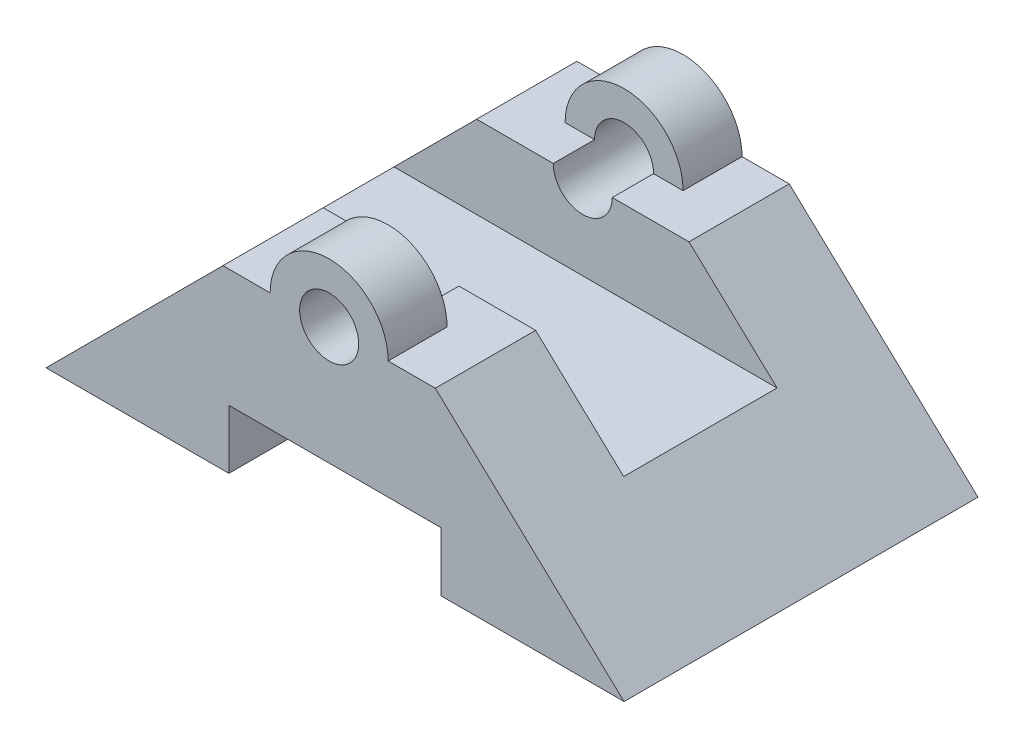
ISO-10303-21;
HEADER;
FILE_DESCRIPTION(('STEP AP214'),'2;1');
FILE_NAME('part.step','',(''),(''),'','','');
FILE_SCHEMA(('AUTOMOTIVE_DESIGN { 1 0 10303 214 1 1 1 1 }'));
ENDSEC;
DATA;
#1=APPLICATION_CONTEXT('core data for automotive mechanical design processes');
#2=APPLICATION_PROTOCOL_DEFINITION('international standard','automotive_design',2000,#1);
#3=PRODUCT_CONTEXT('',#1,'mechanical');
#4=PRODUCT('Part','Part','',(#3));
#5=PRODUCT_RELATED_PRODUCT_CATEGORY('part','',(#4));
#6=PRODUCT_DEFINITION_FORMATION('','',#4);
#7=PRODUCT_DEFINITION_CONTEXT('part definition',#1,'design');
#8=PRODUCT_DEFINITION('design','',#6,#7);
#9=PRODUCT_DEFINITION_SHAPE('','',#8);
#10=(LENGTH_UNIT() NAMED_UNIT(*) SI_UNIT(.MILLI.,.METRE.));
#11=(NAMED_UNIT(*) PLANE_ANGLE_UNIT() SI_UNIT($,.RADIAN.));
#12=(NAMED_UNIT(*) SI_UNIT($,.STERADIAN.) SOLID_ANGLE_UNIT());
#13=UNCERTAINTY_MEASURE_WITH_UNIT(LENGTH_MEASURE(1.E-05),#10,'distance_accuracy_value','');
#14=(GEOMETRIC_REPRESENTATION_CONTEXT(3) GLOBAL_UNCERTAINTY_ASSIGNED_CONTEXT((#13)) GLOBAL_UNIT_ASSIGNED_CONTEXT((#10,
#11,#12)) REPRESENTATION_CONTEXT('',''));
#15=CARTESIAN_POINT('',(0.,0.,0.));
#16=DIRECTION('',(0.,0.,1.));
#17=DIRECTION('',(1.,0.,0.));
#18=AXIS2_PLACEMENT_3D('',#15,#16,#17);
#19=CARTESIAN_POINT('',(-5.21948843325752,15.1358930192069,-17.));
#20=DIRECTION('',(0.,1.,0.));
#21=DIRECTION('',(0.,0.,1.));
#22=AXIS2_PLACEMENT_3D('',#19,#20,#21);
#23=PLANE('',#22);
#24=DIRECTION('',(0.,0.,1.));
#25=VECTOR('',#24,1.);
#26=CARTESIAN_POINT('',(7.78051156674249,15.1358930192069,-17.));
#27=LINE('',#26,#25);
#28=CARTESIAN_POINT('',(7.78051156674249,15.1358930192069,-17.));
#29=VERTEX_POINT('',#28);
#30=CARTESIAN_POINT('',(7.78051156674249,15.1358930192069,-10.));
#31=VERTEX_POINT('',#30);
#32=EDGE_CURVE('E62',#29,#31,#27,.T.);
#33=ORIENTED_EDGE('',*,*,#32,.F.);
#34=DIRECTION('',(-1.,0.,0.));
#35=VECTOR('',#34,1.);
#36=CARTESIAN_POINT('',(30.7805115667425,15.1358930192069,-17.));
#37=LINE('',#36,#35);
#38=CARTESIAN_POINT('',(-5.21948843325752,15.1358930192069,-17.));
#39=VERTEX_POINT('',#38);
#40=EDGE_CURVE('E269',#29,#39,#37,.T.);
#41=ORIENTED_EDGE('',*,*,#40,.T.);
#42=DIRECTION('',(0.,0.,1.));
#43=VECTOR('',#42,1.);
#44=CARTESIAN_POINT('',(-5.21948843325752,15.1358930192069,-17.));
#45=LINE('',#44,#43);
#46=CARTESIAN_POINT('',(-5.21948843325752,15.1358930192069,0.));
#47=VERTEX_POINT('',#46);
#48=EDGE_CURVE('E303',#39,#47,#45,.T.);
#49=ORIENTED_EDGE('',*,*,#48,.T.);
#50=DIRECTION('',(-1.,0.,0.));
#51=VECTOR('',#50,1.);
#52=CARTESIAN_POINT('',(-5.21948843325752,15.1358930192069,0.));
#53=LINE('',#52,#51);
#54=CARTESIAN_POINT('',(2.78051156674249,15.1358930192069,0.));
#55=VERTEX_POINT('',#54);
#56=EDGE_CURVE('E291',#55,#47,#53,.T.);
#57=ORIENTED_EDGE('',*,*,#56,.F.);
#58=DIRECTION('',(0.,0.,1.));
#59=VECTOR('',#58,1.);
#60=CARTESIAN_POINT('',(2.78051156674249,15.1358930192069,-10.));
#61=LINE('',#60,#59);
#62=CARTESIAN_POINT('',(2.78051156674249,15.1358930192069,-10.));
#63=VERTEX_POINT('',#62);
#64=EDGE_CURVE('E261',#63,#55,#61,.T.);
#65=ORIENTED_EDGE('',*,*,#64,.F.);
#66=DIRECTION('',(-1.,0.,0.));
#67=VECTOR('',#66,1.);
#68=CARTESIAN_POINT('',(0.,15.1358930192069,-10.));
#69=LINE('',#68,#67);
#70=EDGE_CURVE('E256',#31,#63,#69,.T.);
#71=ORIENTED_EDGE('',*,*,#70,.F.);
#72=EDGE_LOOP('',(#33,#41,#49,#57,#65,#71));
#73=FACE_BOUND('',#72,.T.);
#74=ADVANCED_FACE('F39',(#73),#23,.T.);
#75=CARTESIAN_POINT('',(-4.2194884332574,-14.8641069807931,-17.));
#76=DIRECTION('',(1.,0.,0.));
#77=DIRECTION('',(0.,0.,-1.));
#78=AXIS2_PLACEMENT_3D('',#75,#76,#77);
#79=PLANE('',#78);
#80=DIRECTION('',(0.,1.,0.));
#81=VECTOR('',#80,1.);
#82=CARTESIAN_POINT('',(-4.2194884332574,-14.8641069807931,0.));
#83=LINE('',#82,#81);
#84=CARTESIAN_POINT('',(-4.2194884332574,-14.8641069807931,0.));
#85=VERTEX_POINT('',#84);
#86=CARTESIAN_POINT('',(-4.2194884332574,-4.8641069807931,0.));
#87=VERTEX_POINT('',#86);
#88=EDGE_CURVE('E264',#85,#87,#83,.T.);
#89=ORIENTED_EDGE('',*,*,#88,.F.);
#90=DIRECTION('',(0.,0.,1.));
#91=VECTOR('',#90,1.);
#92=CARTESIAN_POINT('',(-4.2194884332574,-14.8641069807931,-17.));
#93=LINE('',#92,#91);
#94=CARTESIAN_POINT('',(-4.2194884332574,-14.8641069807931,-60.));
#95=VERTEX_POINT('',#94);
#96=EDGE_CURVE('E47',#95,#85,#93,.T.);
#97=ORIENTED_EDGE('',*,*,#96,.F.);
#98=DIRECTION('',(0.,1.,0.));
#99=VECTOR('',#98,1.);
#100=CARTESIAN_POINT('',(-4.2194884332574,-14.8641069807931,-60.));
#101=LINE('',#100,#99);
#102=CARTESIAN_POINT('',(-4.2194884332574,-4.8641069807931,-60.));
#103=VERTEX_POINT('',#102);
#104=EDGE_CURVE('E213',#95,#103,#101,.T.);
#105=ORIENTED_EDGE('',*,*,#104,.T.);
#106=DIRECTION('',(0.,0.,1.));
#107=VECTOR('',#106,1.);
#108=CARTESIAN_POINT('',(-4.2194884332574,-4.8641069807931,-17.));
#109=LINE('',#108,#107);
#110=EDGE_CURVE('E276',#103,#87,#109,.T.);
#111=ORIENTED_EDGE('',*,*,#110,.T.);
#112=EDGE_LOOP('',(#89,#97,#105,#111));
#113=FACE_BOUND('',#112,.T.);
#114=ADVANCED_FACE('F41',(#113),#79,.T.);
#115=CARTESIAN_POINT('',(-35.2194884332574,-14.8641069807931,-17.));
#116=DIRECTION('',(0.,-1.,0.));
#117=DIRECTION('',(0.,0.,-1.));
#118=AXIS2_PLACEMENT_3D('',#115,#116,#117);
#119=PLANE('',#118);
#120=DIRECTION('',(1.,0.,0.));
#121=VECTOR('',#120,1.);
#122=CARTESIAN_POINT('',(-35.2194884332574,-14.8641069807931,0.));
#123=LINE('',#122,#121);
#124=CARTESIAN_POINT('',(-35.2194884332574,-14.8641069807931,0.));
#125=VERTEX_POINT('',#124);
#126=EDGE_CURVE('E270',#125,#85,#123,.T.);
#127=ORIENTED_EDGE('',*,*,#126,.F.);
#128=DIRECTION('',(0.,0.,1.));
#129=VECTOR('',#128,1.);
#130=CARTESIAN_POINT('',(-35.2194884332574,-14.8641069807931,-17.));
#131=LINE('',#130,#129);
#132=CARTESIAN_POINT('',(-35.2194884332574,-14.8641069807931,-60.));
#133=VERTEX_POINT('',#132);
#134=EDGE_CURVE('E301',#133,#125,#131,.T.);
#135=ORIENTED_EDGE('',*,*,#134,.F.);
#136=DIRECTION('',(1.,0.,0.));
#137=VECTOR('',#136,1.);
#138=CARTESIAN_POINT('',(-35.2194884332574,-14.8641069807931,-60.));
#139=LINE('',#138,#137);
#140=EDGE_CURVE('E201',#133,#95,#139,.T.);
#141=ORIENTED_EDGE('',*,*,#140,.T.);
#142=ORIENTED_EDGE('',*,*,#96,.T.);
#143=EDGE_LOOP('',(#127,#135,#141,#142));
#144=FACE_BOUND('',#143,.T.);
#145=ADVANCED_FACE('F327',(#144),#119,.T.);
#146=CARTESIAN_POINT('',(-35.2194884332574,-14.8641069807931,-17.));
#147=DIRECTION('',(-0.707106781186549,0.707106781186546,0.));
#148=DIRECTION('',(-0.707106781186546,-0.707106781186549,0.));
#149=AXIS2_PLACEMENT_3D('',#146,#147,#148);
#150=PLANE('',#149);
#151=DIRECTION('',(-0.707106781186546,-0.707106781186549,0.));
#152=VECTOR('',#151,1.);
#153=CARTESIAN_POINT('',(-35.2194884332574,-14.8641069807931,0.));
#154=LINE('',#153,#152);
#155=EDGE_CURVE('E295',#47,#125,#154,.T.);
#156=ORIENTED_EDGE('',*,*,#155,.F.);
#157=ORIENTED_EDGE('',*,*,#48,.F.);
#158=DIRECTION('',(-0.707106781186546,-0.707106781186549,0.));
#159=VECTOR('',#158,1.);
#160=CARTESIAN_POINT('',(-35.2194884332574,-14.8641069807931,-17.));
#161=LINE('',#160,#159);
#162=CARTESIAN_POINT('',(-19.2194884332575,1.13589301920689,-17.));
#163=VERTEX_POINT('',#162);
#164=EDGE_CURVE('E274',#39,#163,#161,.T.);
#165=ORIENTED_EDGE('',*,*,#164,.T.);
#166=DIRECTION('',(0.,0.,1.));
#167=VECTOR('',#166,1.);
#168=CARTESIAN_POINT('',(-19.2194884332575,1.13589301920689,-30.));
#169=LINE('',#168,#167);
#170=CARTESIAN_POINT('',(-19.2194884332575,1.13589301920689,-43.));
#171=VERTEX_POINT('',#170);
#172=EDGE_CURVE('E184',#171,#163,#169,.T.);
#173=ORIENTED_EDGE('',*,*,#172,.F.);
#174=DIRECTION('',(-0.707106781186546,-0.707106781186549,0.));
#175=VECTOR('',#174,1.);
#176=CARTESIAN_POINT('',(-35.2194884332574,-14.8641069807931,-43.));
#177=LINE('',#176,#175);
#178=CARTESIAN_POINT('',(-5.21948843325752,15.1358930192069,-43.));
#179=VERTEX_POINT('',#178);
#180=EDGE_CURVE('E192',#179,#171,#177,.T.);
#181=ORIENTED_EDGE('',*,*,#180,.F.);
#182=DIRECTION('',(0.,0.,-1.));
#183=VECTOR('',#182,1.);
#184=CARTESIAN_POINT('',(-5.21948843325752,15.1358930192069,-43.));
#185=LINE('',#184,#183);
#186=CARTESIAN_POINT('',(-5.21948843325752,15.1358930192069,-60.));
#187=VERTEX_POINT('',#186);
#188=EDGE_CURVE('E234',#179,#187,#185,.T.);
#189=ORIENTED_EDGE('',*,*,#188,.T.);
#190=DIRECTION('',(-0.707106781186546,-0.707106781186549,0.));
#191=VECTOR('',#190,1.);
#192=CARTESIAN_POINT('',(-35.2194884332574,-14.8641069807931,-60.));
#193=LINE('',#192,#191);
#194=EDGE_CURVE('E206',#187,#133,#193,.T.);
#195=ORIENTED_EDGE('',*,*,#194,.T.);
#196=ORIENTED_EDGE('',*,*,#134,.T.);
#197=EDGE_LOOP('',(#156,#157,#165,#173,#181,#189,#195,#196));
#198=FACE_BOUND('',#197,.T.);
#199=ADVANCED_FACE('F360',(#198),#150,.T.);
#200=DIRECTION('',(0.,0.,1.));
#201=VECTOR('',#200,1.);
#202=CARTESIAN_POINT('',(17.7805115667425,15.1358930192069,-17.));
#203=LINE('',#202,#201);
#204=CARTESIAN_POINT('',(17.7805115667425,15.1358930192069,-10.));
#205=VERTEX_POINT('',#204);
#206=CARTESIAN_POINT('',(17.7805115667425,15.1358930192069,-17.));
#207=VERTEX_POINT('',#206);
#208=EDGE_CURVE('E246',#205,#207,#203,.F.);
#209=ORIENTED_EDGE('',*,*,#208,.F.);
#210=CARTESIAN_POINT('',(22.7805115667425,15.1358930192069,-10.));
#211=VERTEX_POINT('',#210);
#212=EDGE_CURVE('E252',#211,#205,#69,.T.);
#213=ORIENTED_EDGE('',*,*,#212,.F.);
#214=DIRECTION('',(0.,0.,1.));
#215=VECTOR('',#214,1.);
#216=CARTESIAN_POINT('',(22.7805115667425,15.1358930192069,-10.));
#217=LINE('',#216,#215);
#218=CARTESIAN_POINT('',(22.7805115667425,15.1358930192069,0.));
#219=VERTEX_POINT('',#218);
#220=EDGE_CURVE('E259',#211,#219,#217,.T.);
#221=ORIENTED_EDGE('',*,*,#220,.T.);
#222=CARTESIAN_POINT('',(30.7805115667425,15.1358930192069,0.));
#223=VERTEX_POINT('',#222);
#224=EDGE_CURVE('E292',#223,#219,#53,.T.);
#225=ORIENTED_EDGE('',*,*,#224,.F.);
#226=DIRECTION('',(0.,0.,1.));
#227=VECTOR('',#226,1.);
#228=CARTESIAN_POINT('',(30.7805115667425,15.1358930192069,-17.));
#229=LINE('',#228,#227);
#230=CARTESIAN_POINT('',(30.7805115667425,15.1358930192069,-17.));
#231=VERTEX_POINT('',#230);
#232=EDGE_CURVE('E306',#231,#223,#229,.T.);
#233=ORIENTED_EDGE('',*,*,#232,.F.);
#234=EDGE_CURVE('E271',#231,#207,#37,.T.);
#235=ORIENTED_EDGE('',*,*,#234,.T.);
#236=EDGE_LOOP('',(#209,#213,#221,#225,#233,#235));
#237=FACE_BOUND('',#236,.T.);
#238=ADVANCED_FACE('F343',(#237),#23,.T.);
#239=CARTESIAN_POINT('',(62.7805115667426,-14.8641069807931,-17.));
#240=DIRECTION('',(0.683941128881328,0.729537204140087,0.));
#241=DIRECTION('',(-0.729537204140087,0.683941128881328,0.));
#242=AXIS2_PLACEMENT_3D('',#239,#240,#241);
#243=PLANE('',#242);
#244=DIRECTION('',(-0.729537204140086,0.683941128881328,0.));
#245=VECTOR('',#244,1.);
#246=CARTESIAN_POINT('',(62.7805115667426,-14.8641069807931,0.));
#247=LINE('',#246,#245);
#248=CARTESIAN_POINT('',(62.7805115667426,-14.8641069807931,0.));
#249=VERTEX_POINT('',#248);
#250=EDGE_CURVE('E288',#249,#223,#247,.T.);
#251=ORIENTED_EDGE('',*,*,#250,.F.);
#252=DIRECTION('',(0.,0.,1.));
#253=VECTOR('',#252,1.);
#254=CARTESIAN_POINT('',(62.7805115667426,-14.8641069807931,-17.));
#255=LINE('',#254,#253);
#256=CARTESIAN_POINT('',(62.7805115667426,-14.8641069807931,-60.));
#257=VERTEX_POINT('',#256);
#258=EDGE_CURVE('E309',#257,#249,#255,.T.);
#259=ORIENTED_EDGE('',*,*,#258,.F.);
#260=DIRECTION('',(-0.729537204140086,0.683941128881328,0.));
#261=VECTOR('',#260,1.);
#262=CARTESIAN_POINT('',(62.7805115667426,-14.8641069807931,-60.));
#263=LINE('',#262,#261);
#264=CARTESIAN_POINT('',(30.7805115667425,15.1358930192069,-60.));
#265=VERTEX_POINT('',#264);
#266=EDGE_CURVE('E226',#257,#265,#263,.T.);
#267=ORIENTED_EDGE('',*,*,#266,.T.);
#268=DIRECTION('',(0.,0.,-1.));
#269=VECTOR('',#268,1.);
#270=CARTESIAN_POINT('',(30.7805115667425,15.1358930192069,-43.));
#271=LINE('',#270,#269);
#272=CARTESIAN_POINT('',(30.7805115667425,15.1358930192069,-43.));
#273=VERTEX_POINT('',#272);
#274=EDGE_CURVE('E198',#273,#265,#271,.T.);
#275=ORIENTED_EDGE('',*,*,#274,.F.);
#276=DIRECTION('',(-0.729537204140086,0.683941128881328,0.));
#277=VECTOR('',#276,1.);
#278=CARTESIAN_POINT('',(62.7805115667426,-14.8641069807931,-43.));
#279=LINE('',#278,#277);
#280=CARTESIAN_POINT('',(45.7138449000759,1.13589301920689,-43.));
#281=VERTEX_POINT('',#280);
#282=EDGE_CURVE('E189',#281,#273,#279,.T.);
#283=ORIENTED_EDGE('',*,*,#282,.F.);
#284=DIRECTION('',(0.,0.,1.));
#285=VECTOR('',#284,1.);
#286=CARTESIAN_POINT('',(45.7138449000759,1.13589301920689,-30.));
#287=LINE('',#286,#285);
#288=CARTESIAN_POINT('',(45.7138449000759,1.13589301920689,-17.));
#289=VERTEX_POINT('',#288);
#290=EDGE_CURVE('E176',#281,#289,#287,.T.);
#291=ORIENTED_EDGE('',*,*,#290,.T.);
#292=DIRECTION('',(-0.729537204140086,0.683941128881328,0.));
#293=VECTOR('',#292,1.);
#294=CARTESIAN_POINT('',(62.7805115667426,-14.8641069807931,-17.));
#295=LINE('',#294,#293);
#296=EDGE_CURVE('E267',#289,#231,#295,.T.);
#297=ORIENTED_EDGE('',*,*,#296,.T.);
#298=ORIENTED_EDGE('',*,*,#232,.T.);
#299=EDGE_LOOP('',(#251,#259,#267,#275,#283,#291,#297,#298));
#300=FACE_BOUND('',#299,.T.);
#301=ADVANCED_FACE('F196',(#300),#243,.T.);
#302=CARTESIAN_POINT('',(31.7805115667426,-14.8641069807931,-17.));
#303=DIRECTION('',(0.,-1.,0.));
#304=DIRECTION('',(0.,0.,-1.));
#305=AXIS2_PLACEMENT_3D('',#302,#303,#304);
#306=PLANE('',#305);
#307=DIRECTION('',(1.,0.,0.));
#308=VECTOR('',#307,1.);
#309=CARTESIAN_POINT('',(31.7805115667426,-14.8641069807931,0.));
#310=LINE('',#309,#308);
#311=CARTESIAN_POINT('',(31.7805115667426,-14.8641069807931,0.));
#312=VERTEX_POINT('',#311);
#313=EDGE_CURVE('E285',#312,#249,#310,.T.);
#314=ORIENTED_EDGE('',*,*,#313,.F.);
#315=DIRECTION('',(0.,0.,1.));
#316=VECTOR('',#315,1.);
#317=CARTESIAN_POINT('',(31.7805115667426,-14.8641069807931,-17.));
#318=LINE('',#317,#316);
#319=CARTESIAN_POINT('',(31.7805115667426,-14.8641069807931,-60.));
#320=VERTEX_POINT('',#319);
#321=EDGE_CURVE('E311',#320,#312,#318,.T.);
#322=ORIENTED_EDGE('',*,*,#321,.F.);
#323=DIRECTION('',(1.,0.,0.));
#324=VECTOR('',#323,1.);
#325=CARTESIAN_POINT('',(31.7805115667426,-14.8641069807931,-60.));
#326=LINE('',#325,#324);
#327=EDGE_CURVE('E223',#320,#257,#326,.T.);
#328=ORIENTED_EDGE('',*,*,#327,.T.);
#329=ORIENTED_EDGE('',*,*,#258,.T.);
#330=EDGE_LOOP('',(#314,#322,#328,#329));
#331=FACE_BOUND('',#330,.T.);
#332=ADVANCED_FACE('F338',(#331),#306,.T.);
#333=CARTESIAN_POINT('',(31.7805115667426,-4.8641069807931,-17.));
#334=DIRECTION('',(-1.,0.,0.));
#335=DIRECTION('',(0.,0.,1.));
#336=AXIS2_PLACEMENT_3D('',#333,#334,#335);
#337=PLANE('',#336);
#338=DIRECTION('',(0.,-1.,0.));
#339=VECTOR('',#338,1.);
#340=CARTESIAN_POINT('',(31.7805115667426,-4.8641069807931,0.));
#341=LINE('',#340,#339);
#342=CARTESIAN_POINT('',(31.7805115667426,-4.8641069807931,0.));
#343=VERTEX_POINT('',#342);
#344=EDGE_CURVE('E282',#343,#312,#341,.T.);
#345=ORIENTED_EDGE('',*,*,#344,.F.);
#346=DIRECTION('',(0.,0.,1.));
#347=VECTOR('',#346,1.);
#348=CARTESIAN_POINT('',(31.7805115667426,-4.8641069807931,-17.));
#349=LINE('',#348,#347);
#350=CARTESIAN_POINT('',(31.7805115667426,-4.8641069807931,-60.));
#351=VERTEX_POINT('',#350);
#352=EDGE_CURVE('E313',#351,#343,#349,.T.);
#353=ORIENTED_EDGE('',*,*,#352,.F.);
#354=DIRECTION('',(0.,-1.,0.));
#355=VECTOR('',#354,1.);
#356=CARTESIAN_POINT('',(31.7805115667426,-4.8641069807931,-60.));
#357=LINE('',#356,#355);
#358=EDGE_CURVE('E220',#351,#320,#357,.T.);
#359=ORIENTED_EDGE('',*,*,#358,.T.);
#360=ORIENTED_EDGE('',*,*,#321,.T.);
#361=EDGE_LOOP('',(#345,#353,#359,#360));
#362=FACE_BOUND('',#361,.T.);
#363=ADVANCED_FACE('F335',(#362),#337,.T.);
#364=CARTESIAN_POINT('',(-4.2194884332574,-4.8641069807931,-17.));
#365=DIRECTION('',(0.,-1.,0.));
#366=DIRECTION('',(0.,0.,-1.));
#367=AXIS2_PLACEMENT_3D('',#364,#365,#366);
#368=PLANE('',#367);
#369=DIRECTION('',(1.,0.,0.));
#370=VECTOR('',#369,1.);
#371=CARTESIAN_POINT('',(-4.2194884332574,-4.8641069807931,0.));
#372=LINE('',#371,#370);
#373=EDGE_CURVE('E279',#87,#343,#372,.T.);
#374=ORIENTED_EDGE('',*,*,#373,.F.);
#375=ORIENTED_EDGE('',*,*,#110,.F.);
#376=DIRECTION('',(1.,0.,0.));
#377=VECTOR('',#376,1.);
#378=CARTESIAN_POINT('',(-4.2194884332574,-4.8641069807931,-60.));
#379=LINE('',#378,#377);
#380=EDGE_CURVE('E216',#103,#351,#379,.T.);
#381=ORIENTED_EDGE('',*,*,#380,.T.);
#382=ORIENTED_EDGE('',*,*,#352,.T.);
#383=EDGE_LOOP('',(#374,#375,#381,#382));
#384=FACE_BOUND('',#383,.T.);
#385=ADVANCED_FACE('F320',(#384),#368,.T.);
#386=CARTESIAN_POINT('',(0.,0.,-17.));
#387=DIRECTION('',(0.,0.,-1.));
#388=DIRECTION('',(-1.,0.,0.));
#389=AXIS2_PLACEMENT_3D('',#386,#387,#388);
#390=PLANE('',#389);
#391=DIRECTION('',(1.,0.,0.));
#392=VECTOR('',#391,1.);
#393=CARTESIAN_POINT('',(45.7138449000759,1.13589301920689,-17.));
#394=LINE('',#393,#392);
#395=EDGE_CURVE('E54',#163,#289,#394,.T.);
#396=ORIENTED_EDGE('',*,*,#395,.F.);
#397=ORIENTED_EDGE('',*,*,#164,.F.);
#398=ORIENTED_EDGE('',*,*,#40,.F.);
#399=CARTESIAN_POINT('',(12.7805115667425,15.1358930192069,-17.));
#400=DIRECTION('',(0.,0.,1.));
#401=DIRECTION('',(1.,0.,0.));
#402=AXIS2_PLACEMENT_3D('',#399,#400,#401);
#403=CIRCLE('',#402,5.);
#404=EDGE_CURVE('E243',#29,#207,#403,.T.);
#405=ORIENTED_EDGE('',*,*,#404,.T.);
#406=ORIENTED_EDGE('',*,*,#234,.F.);
#407=ORIENTED_EDGE('',*,*,#296,.F.);
#408=EDGE_LOOP('',(#396,#397,#398,#405,#406,#407));
#409=FACE_BOUND('',#408,.T.);
#410=ADVANCED_FACE('F344',(#409),#390,.T.);
#411=CARTESIAN_POINT('',(0.,0.,0.));
#412=DIRECTION('',(0.,0.,-1.));
#413=DIRECTION('',(-1.,0.,0.));
#414=AXIS2_PLACEMENT_3D('',#411,#412,#413);
#415=PLANE('',#414);
#416=CARTESIAN_POINT('',(12.7805115667425,15.1358930192069,0.));
#417=DIRECTION('',(0.,0.,1.));
#418=DIRECTION('',(1.,0.,0.));
#419=AXIS2_PLACEMENT_3D('',#416,#417,#418);
#420=CIRCLE('',#419,5.);
#421=CARTESIAN_POINT('',(17.7805115667425,15.1358930192069,0.));
#422=VERTEX_POINT('',#421);
#423=EDGE_CURVE('E242',#422,#422,#420,.T.);
#424=ORIENTED_EDGE('',*,*,#423,.F.);
#425=EDGE_LOOP('',(#424));
#426=FACE_BOUND('',#425,.T.);
#427=ORIENTED_EDGE('',*,*,#88,.T.);
#428=ORIENTED_EDGE('',*,*,#373,.T.);
#429=ORIENTED_EDGE('',*,*,#344,.T.);
#430=ORIENTED_EDGE('',*,*,#313,.T.);
#431=ORIENTED_EDGE('',*,*,#250,.T.);
#432=ORIENTED_EDGE('',*,*,#224,.T.);
#433=CARTESIAN_POINT('',(12.7805115667425,15.1358930192069,0.));
#434=DIRECTION('',(0.,0.,1.));
#435=DIRECTION('',(1.,0.,0.));
#436=AXIS2_PLACEMENT_3D('',#433,#434,#435);
#437=CIRCLE('',#436,10.);
#438=EDGE_CURVE('E251',#219,#55,#437,.T.);
#439=ORIENTED_EDGE('',*,*,#438,.T.);
#440=ORIENTED_EDGE('',*,*,#56,.T.);
#441=ORIENTED_EDGE('',*,*,#155,.T.);
#442=ORIENTED_EDGE('',*,*,#126,.T.);
#443=EDGE_LOOP('',(#427,#428,#429,#430,#431,#432,#439,#440,#441,#442));
#444=FACE_BOUND('',#443,.T.);
#445=ADVANCED_FACE('F323',(#426,#444),#415,.F.);
#446=CARTESIAN_POINT('',(12.7805115667425,15.1358930192069,-10.));
#447=DIRECTION('',(0.,0.,1.));
#448=DIRECTION('',(1.,0.,0.));
#449=AXIS2_PLACEMENT_3D('',#446,#447,#448);
#450=CYLINDRICAL_SURFACE('',#449,10.);
#451=ORIENTED_EDGE('',*,*,#438,.F.);
#452=ORIENTED_EDGE('',*,*,#220,.F.);
#453=CARTESIAN_POINT('',(12.7805115667425,15.1358930192069,-10.));
#454=DIRECTION('',(0.,0.,1.));
#455=DIRECTION('',(1.,0.,0.));
#456=AXIS2_PLACEMENT_3D('',#453,#454,#455);
#457=CIRCLE('',#456,10.);
#458=EDGE_CURVE('E255',#211,#63,#457,.T.);
#459=ORIENTED_EDGE('',*,*,#458,.T.);
#460=ORIENTED_EDGE('',*,*,#64,.T.);
#461=EDGE_LOOP('',(#451,#452,#459,#460));
#462=FACE_BOUND('',#461,.T.);
#463=ADVANCED_FACE('F358',(#462),#450,.T.);
#464=CARTESIAN_POINT('',(0.,0.,-10.));
#465=DIRECTION('',(0.,0.,1.));
#466=DIRECTION('',(1.,0.,0.));
#467=AXIS2_PLACEMENT_3D('',#464,#465,#466);
#468=PLANE('',#467);
#469=ORIENTED_EDGE('',*,*,#212,.T.);
#470=CARTESIAN_POINT('',(12.7805115667425,15.1358930192069,-10.));
#471=DIRECTION('',(0.,0.,1.));
#472=DIRECTION('',(1.,0.,0.));
#473=AXIS2_PLACEMENT_3D('',#470,#471,#472);
#474=CIRCLE('',#473,5.);
#475=EDGE_CURVE('E11',#205,#31,#474,.T.);
#476=ORIENTED_EDGE('',*,*,#475,.T.);
#477=ORIENTED_EDGE('',*,*,#70,.T.);
#478=ORIENTED_EDGE('',*,*,#458,.F.);
#479=EDGE_LOOP('',(#469,#476,#477,#478));
#480=FACE_BOUND('',#479,.T.);
#481=ADVANCED_FACE('F355',(#480),#468,.F.);
#482=CARTESIAN_POINT('',(12.7805115667425,15.1358930192069,-17.));
#483=DIRECTION('',(0.,0.,1.));
#484=DIRECTION('',(1.,0.,0.));
#485=AXIS2_PLACEMENT_3D('',#482,#483,#484);
#486=CYLINDRICAL_SURFACE('',#485,5.);
#487=ORIENTED_EDGE('',*,*,#32,.T.);
#488=ORIENTED_EDGE('',*,*,#475,.F.);
#489=ORIENTED_EDGE('',*,*,#208,.T.);
#490=ORIENTED_EDGE('',*,*,#404,.F.);
#491=EDGE_LOOP('',(#487,#488,#489,#490));
#492=FACE_BOUND('',#491,.T.);
#493=ORIENTED_EDGE('',*,*,#423,.T.);
#494=EDGE_LOOP('',(#493));
#495=FACE_BOUND('',#494,.T.);
#496=ADVANCED_FACE('F346',(#492,#495),#486,.F.);
#497=CARTESIAN_POINT('',(45.7138449000759,1.13589301920689,-30.));
#498=DIRECTION('',(0.,-1.,0.));
#499=DIRECTION('',(1.,0.,0.));
#500=AXIS2_PLACEMENT_3D('',#497,#498,#499);
#501=PLANE('',#500);
#502=ORIENTED_EDGE('',*,*,#395,.T.);
#503=ORIENTED_EDGE('',*,*,#290,.F.);
#504=DIRECTION('',(1.,0.,0.));
#505=VECTOR('',#504,1.);
#506=CARTESIAN_POINT('',(45.7138449000759,1.13589301920689,-43.));
#507=LINE('',#506,#505);
#508=EDGE_CURVE('E180',#171,#281,#507,.T.);
#509=ORIENTED_EDGE('',*,*,#508,.F.);
#510=ORIENTED_EDGE('',*,*,#172,.T.);
#511=EDGE_LOOP('',(#502,#503,#509,#510));
#512=FACE_BOUND('',#511,.T.);
#513=ADVANCED_FACE('F178',(#512),#501,.F.);
#514=CARTESIAN_POINT('',(-5.21948843325752,15.1358930192069,-43.));
#515=DIRECTION('',(0.,1.,0.));
#516=DIRECTION('',(0.,0.,-1.));
#517=AXIS2_PLACEMENT_3D('',#514,#515,#516);
#518=PLANE('',#517);
#519=DIRECTION('',(0.,0.,-1.));
#520=VECTOR('',#519,1.);
#521=CARTESIAN_POINT('',(7.78051156674249,15.1358930192069,-43.));
#522=LINE('',#521,#520);
#523=CARTESIAN_POINT('',(7.78051156674249,15.1358930192069,-43.));
#524=VERTEX_POINT('',#523);
#525=CARTESIAN_POINT('',(7.78051156674249,15.1358930192069,-50.));
#526=VERTEX_POINT('',#525);
#527=EDGE_CURVE('E379',#524,#526,#522,.T.);
#528=ORIENTED_EDGE('',*,*,#527,.T.);
#529=DIRECTION('',(-1.,0.,0.));
#530=VECTOR('',#529,1.);
#531=CARTESIAN_POINT('',(0.,15.1358930192069,-50.));
#532=LINE('',#531,#530);
#533=CARTESIAN_POINT('',(2.78051156674249,15.1358930192069,-50.));
#534=VERTEX_POINT('',#533);
#535=EDGE_CURVE('E374',#526,#534,#532,.T.);
#536=ORIENTED_EDGE('',*,*,#535,.T.);
#537=DIRECTION('',(0.,0.,-1.));
#538=VECTOR('',#537,1.);
#539=CARTESIAN_POINT('',(2.78051156674249,15.1358930192069,-50.));
#540=LINE('',#539,#538);
#541=CARTESIAN_POINT('',(2.78051156674249,15.1358930192069,-60.));
#542=VERTEX_POINT('',#541);
#543=EDGE_CURVE('E217',#534,#542,#540,.T.);
#544=ORIENTED_EDGE('',*,*,#543,.T.);
#545=DIRECTION('',(-1.,0.,0.));
#546=VECTOR('',#545,1.);
#547=CARTESIAN_POINT('',(-5.21948843325752,15.1358930192069,-60.));
#548=LINE('',#547,#546);
#549=EDGE_CURVE('E228',#542,#187,#548,.T.);
#550=ORIENTED_EDGE('',*,*,#549,.T.);
#551=ORIENTED_EDGE('',*,*,#188,.F.);
#552=DIRECTION('',(-1.,0.,0.));
#553=VECTOR('',#552,1.);
#554=CARTESIAN_POINT('',(30.7805115667425,15.1358930192069,-43.));
#555=LINE('',#554,#553);
#556=EDGE_CURVE('E200',#524,#179,#555,.T.);
#557=ORIENTED_EDGE('',*,*,#556,.F.);
#558=EDGE_LOOP('',(#528,#536,#544,#550,#551,#557));
#559=FACE_BOUND('',#558,.T.);
#560=ADVANCED_FACE('F372',(#559),#518,.T.);
#561=DIRECTION('',(0.,0.,-1.));
#562=VECTOR('',#561,1.);
#563=CARTESIAN_POINT('',(17.7805115667425,15.1358930192069,-43.));
#564=LINE('',#563,#562);
#565=CARTESIAN_POINT('',(17.7805115667425,15.1358930192069,-50.));
#566=VERTEX_POINT('',#565);
#567=CARTESIAN_POINT('',(17.7805115667425,15.1358930192069,-43.));
#568=VERTEX_POINT('',#567);
#569=EDGE_CURVE('E385',#566,#568,#564,.F.);
#570=ORIENTED_EDGE('',*,*,#569,.T.);
#571=EDGE_CURVE('E203',#273,#568,#555,.T.);
#572=ORIENTED_EDGE('',*,*,#571,.F.);
#573=ORIENTED_EDGE('',*,*,#274,.T.);
#574=CARTESIAN_POINT('',(22.7805115667425,15.1358930192069,-60.));
#575=VERTEX_POINT('',#574);
#576=EDGE_CURVE('E229',#265,#575,#548,.T.);
#577=ORIENTED_EDGE('',*,*,#576,.T.);
#578=DIRECTION('',(0.,0.,-1.));
#579=VECTOR('',#578,1.);
#580=CARTESIAN_POINT('',(22.7805115667425,15.1358930192069,-50.));
#581=LINE('',#580,#579);
#582=CARTESIAN_POINT('',(22.7805115667425,15.1358930192069,-50.));
#583=VERTEX_POINT('',#582);
#584=EDGE_CURVE('E209',#583,#575,#581,.T.);
#585=ORIENTED_EDGE('',*,*,#584,.F.);
#586=EDGE_CURVE('E381',#583,#566,#532,.T.);
#587=ORIENTED_EDGE('',*,*,#586,.T.);
#588=EDGE_LOOP('',(#570,#572,#573,#577,#585,#587));
#589=FACE_BOUND('',#588,.T.);
#590=ADVANCED_FACE('F398',(#589),#518,.T.);
#591=CARTESIAN_POINT('',(0.,0.,-43.));
#592=DIRECTION('',(0.,0.,1.));
#593=DIRECTION('',(-1.,0.,0.));
#594=AXIS2_PLACEMENT_3D('',#591,#592,#593);
#595=PLANE('',#594);
#596=ORIENTED_EDGE('',*,*,#508,.T.);
#597=ORIENTED_EDGE('',*,*,#282,.T.);
#598=ORIENTED_EDGE('',*,*,#571,.T.);
#599=CARTESIAN_POINT('',(12.7805115667425,15.1358930192069,-43.));
#600=DIRECTION('',(0.,0.,1.));
#601=DIRECTION('',(1.,0.,0.));
#602=AXIS2_PLACEMENT_3D('',#599,#600,#601);
#603=CIRCLE('',#602,5.);
#604=EDGE_CURVE('E388',#524,#568,#603,.T.);
#605=ORIENTED_EDGE('',*,*,#604,.F.);
#606=ORIENTED_EDGE('',*,*,#556,.T.);
#607=ORIENTED_EDGE('',*,*,#180,.T.);
#608=EDGE_LOOP('',(#596,#597,#598,#605,#606,#607));
#609=FACE_BOUND('',#608,.T.);
#610=ADVANCED_FACE('F187',(#609),#595,.T.);
#611=CARTESIAN_POINT('',(0.,0.,-60.));
#612=DIRECTION('',(0.,0.,1.));
#613=DIRECTION('',(-1.,0.,0.));
#614=AXIS2_PLACEMENT_3D('',#611,#612,#613);
#615=PLANE('',#614);
#616=CARTESIAN_POINT('',(12.7805115667425,15.1358930192069,-60.));
#617=DIRECTION('',(0.,0.,1.));
#618=DIRECTION('',(1.,0.,0.));
#619=AXIS2_PLACEMENT_3D('',#616,#617,#618);
#620=CIRCLE('',#619,5.);
#621=CARTESIAN_POINT('',(17.7805115667425,15.1358930192069,-60.));
#622=VERTEX_POINT('',#621);
#623=EDGE_CURVE('E193',#622,#622,#620,.T.);
#624=ORIENTED_EDGE('',*,*,#623,.T.);
#625=EDGE_LOOP('',(#624));
#626=FACE_BOUND('',#625,.T.);
#627=ORIENTED_EDGE('',*,*,#104,.F.);
#628=ORIENTED_EDGE('',*,*,#140,.F.);
#629=ORIENTED_EDGE('',*,*,#194,.F.);
#630=ORIENTED_EDGE('',*,*,#549,.F.);
#631=CARTESIAN_POINT('',(12.7805115667425,15.1358930192069,-60.));
#632=DIRECTION('',(0.,0.,1.));
#633=DIRECTION('',(1.,0.,0.));
#634=AXIS2_PLACEMENT_3D('',#631,#632,#633);
#635=CIRCLE('',#634,10.);
#636=EDGE_CURVE('E366',#575,#542,#635,.T.);
#637=ORIENTED_EDGE('',*,*,#636,.F.);
#638=ORIENTED_EDGE('',*,*,#576,.F.);
#639=ORIENTED_EDGE('',*,*,#266,.F.);
#640=ORIENTED_EDGE('',*,*,#327,.F.);
#641=ORIENTED_EDGE('',*,*,#358,.F.);
#642=ORIENTED_EDGE('',*,*,#380,.F.);
#643=EDGE_LOOP('',(#627,#628,#629,#630,#637,#638,#639,#640,#641,#642));
#644=FACE_BOUND('',#643,.T.);
#645=ADVANCED_FACE('F330',(#626,#644),#615,.F.);
#646=CARTESIAN_POINT('',(12.7805115667425,15.1358930192069,-50.));
#647=DIRECTION('',(0.,0.,-1.));
#648=DIRECTION('',(1.,0.,0.));
#649=AXIS2_PLACEMENT_3D('',#646,#647,#648);
#650=CYLINDRICAL_SURFACE('',#649,10.);
#651=ORIENTED_EDGE('',*,*,#636,.T.);
#652=ORIENTED_EDGE('',*,*,#543,.F.);
#653=CARTESIAN_POINT('',(12.7805115667425,15.1358930192069,-50.));
#654=DIRECTION('',(0.,0.,1.));
#655=DIRECTION('',(1.,0.,0.));
#656=AXIS2_PLACEMENT_3D('',#653,#654,#655);
#657=CIRCLE('',#656,10.);
#658=EDGE_CURVE('E376',#583,#534,#657,.T.);
#659=ORIENTED_EDGE('',*,*,#658,.F.);
#660=ORIENTED_EDGE('',*,*,#584,.T.);
#661=EDGE_LOOP('',(#651,#652,#659,#660));
#662=FACE_BOUND('',#661,.T.);
#663=ADVANCED_FACE('F403',(#662),#650,.T.);
#664=CARTESIAN_POINT('',(0.,0.,-50.));
#665=DIRECTION('',(0.,0.,-1.));
#666=DIRECTION('',(1.,0.,0.));
#667=AXIS2_PLACEMENT_3D('',#664,#665,#666);
#668=PLANE('',#667);
#669=ORIENTED_EDGE('',*,*,#586,.F.);
#670=ORIENTED_EDGE('',*,*,#658,.T.);
#671=ORIENTED_EDGE('',*,*,#535,.F.);
#672=CARTESIAN_POINT('',(12.7805115667425,15.1358930192069,-50.));
#673=DIRECTION('',(0.,0.,1.));
#674=DIRECTION('',(1.,0.,0.));
#675=AXIS2_PLACEMENT_3D('',#672,#673,#674);
#676=CIRCLE('',#675,5.);
#677=EDGE_CURVE('E237',#566,#526,#676,.T.);
#678=ORIENTED_EDGE('',*,*,#677,.F.);
#679=EDGE_LOOP('',(#669,#670,#671,#678));
#680=FACE_BOUND('',#679,.T.);
#681=ADVANCED_FACE('F402',(#680),#668,.F.);
#682=CARTESIAN_POINT('',(12.7805115667425,15.1358930192069,-43.));
#683=DIRECTION('',(0.,0.,-1.));
#684=DIRECTION('',(1.,0.,0.));
#685=AXIS2_PLACEMENT_3D('',#682,#683,#684);
#686=CYLINDRICAL_SURFACE('',#685,5.);
#687=ORIENTED_EDGE('',*,*,#527,.F.);
#688=ORIENTED_EDGE('',*,*,#604,.T.);
#689=ORIENTED_EDGE('',*,*,#569,.F.);
#690=ORIENTED_EDGE('',*,*,#677,.T.);
#691=EDGE_LOOP('',(#687,#688,#689,#690));
#692=FACE_BOUND('',#691,.T.);
#693=ORIENTED_EDGE('',*,*,#623,.F.);
#694=EDGE_LOOP('',(#693));
#695=FACE_BOUND('',#694,.T.);
#696=ADVANCED_FACE('F394',(#692,#695),#686,.F.);
#697=CLOSED_SHELL('',(#74,#114,#145,#199,#238,#301,#332,#363,#385,#410,#445,#463,#481,#496,#513,
#560,#590,#610,#645,#663,#681,#696));
#698=MANIFOLD_SOLID_BREP('B2',#697);
#699=ADVANCED_BREP_SHAPE_REPRESENTATION('',(#18,#698),#14);
#700=SHAPE_DEFINITION_REPRESENTATION(#9,#699);
ENDSEC;
END-ISO-10303-21;
